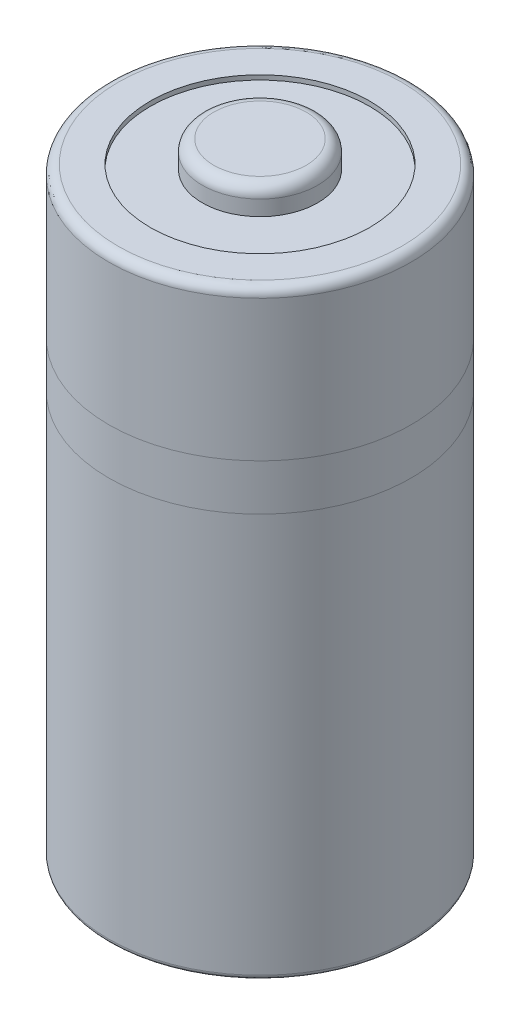
ISO-10303-21;
HEADER;
FILE_DESCRIPTION(('STEP AP214'),'2;1');
FILE_NAME('part.step','',(''),(''),'','','');
FILE_SCHEMA(('AUTOMOTIVE_DESIGN { 1 0 10303 214 1 1 1 1 }'));
ENDSEC;
DATA;
#1=APPLICATION_CONTEXT('core data for automotive mechanical design processes');
#2=APPLICATION_PROTOCOL_DEFINITION('international standard','automotive_design',2000,#1);
#3=PRODUCT_CONTEXT('',#1,'mechanical');
#4=PRODUCT('Part','Part','',(#3));
#5=PRODUCT_RELATED_PRODUCT_CATEGORY('part','',(#4));
#6=PRODUCT_DEFINITION_FORMATION('','',#4);
#7=PRODUCT_DEFINITION_CONTEXT('part definition',#1,'design');
#8=PRODUCT_DEFINITION('design','',#6,#7);
#9=PRODUCT_DEFINITION_SHAPE('','',#8);
#10=(LENGTH_UNIT() NAMED_UNIT(*) SI_UNIT(.MILLI.,.METRE.));
#11=(NAMED_UNIT(*) PLANE_ANGLE_UNIT() SI_UNIT($,.RADIAN.));
#12=(NAMED_UNIT(*) SI_UNIT($,.STERADIAN.) SOLID_ANGLE_UNIT());
#13=UNCERTAINTY_MEASURE_WITH_UNIT(LENGTH_MEASURE(1.E-05),#10,'distance_accuracy_value','');
#14=(GEOMETRIC_REPRESENTATION_CONTEXT(3) GLOBAL_UNCERTAINTY_ASSIGNED_CONTEXT((#13)) GLOBAL_UNIT_ASSIGNED_CONTEXT((#10,
#11,#12)) REPRESENTATION_CONTEXT('',''));
#15=CARTESIAN_POINT('',(0.,0.,0.));
#16=DIRECTION('',(0.,0.,1.));
#17=DIRECTION('',(1.,0.,0.));
#18=AXIS2_PLACEMENT_3D('',#15,#16,#17);
#19=CARTESIAN_POINT('',(0.,32.7406,0.));
#20=DIRECTION('',(0.,1.,0.));
#21=DIRECTION('',(0.,0.,1.));
#22=AXIS2_PLACEMENT_3D('',#19,#20,#21);
#23=PLANE('',#22);
#24=CARTESIAN_POINT('',(0.,32.7406,0.));
#25=DIRECTION('',(0.,1.,0.));
#26=DIRECTION('',(0.,0.,1.));
#27=AXIS2_PLACEMENT_3D('',#24,#25,#26);
#28=CIRCLE('',#27,6.0325);
#29=CARTESIAN_POINT('',(0.,32.7406,6.0325));
#30=VERTEX_POINT('',#29);
#31=EDGE_CURVE('P0_E130',#30,#30,#28,.T.);
#32=ORIENTED_EDGE('',*,*,#31,.T.);
#33=EDGE_LOOP('',(#32));
#34=FACE_BOUND('',#33,.T.);
#35=ADVANCED_FACE('P0_F16',(#34),#23,.T.);
#36=CARTESIAN_POINT('',(0.,32.7406,0.));
#37=DIRECTION('',(0.,1.,0.));
#38=DIRECTION('',(0.,0.,1.));
#39=AXIS2_PLACEMENT_3D('',#36,#37,#38);
#40=CYLINDRICAL_SURFACE('',#39,6.0325);
#41=CARTESIAN_POINT('',(0.,33.02,0.));
#42=DIRECTION('',(0.,1.,0.));
#43=DIRECTION('',(0.,0.,1.));
#44=AXIS2_PLACEMENT_3D('',#41,#42,#43);
#45=CIRCLE('',#44,6.0325);
#46=CARTESIAN_POINT('',(0.,33.02,6.0325));
#47=VERTEX_POINT('',#46);
#48=EDGE_CURVE('P0_E41',#47,#47,#45,.F.);
#49=ORIENTED_EDGE('',*,*,#48,.F.);
#50=EDGE_LOOP('',(#49));
#51=FACE_BOUND('',#50,.T.);
#52=ORIENTED_EDGE('',*,*,#31,.F.);
#53=EDGE_LOOP('',(#52));
#54=FACE_BOUND('',#53,.T.);
#55=ADVANCED_FACE('P0_F98',(#51,#54),#40,.F.);
#56=CARTESIAN_POINT('',(0.,33.02,0.));
#57=DIRECTION('',(0.,1.,0.));
#58=DIRECTION('',(0.,0.,1.));
#59=AXIS2_PLACEMENT_3D('',#56,#57,#58);
#60=PLANE('',#59);
#61=CARTESIAN_POINT('',(0.,33.02,0.));
#62=DIRECTION('',(0.,-1.,0.));
#63=DIRECTION('',(0.,0.,-1.));
#64=AXIS2_PLACEMENT_3D('',#61,#62,#63);
#65=CIRCLE('',#64,7.8105);
#66=CARTESIAN_POINT('',(0.,33.02,-7.8105));
#67=VERTEX_POINT('',#66);
#68=CARTESIAN_POINT('',(0.,33.02,7.8105));
#69=VERTEX_POINT('',#68);
#70=EDGE_CURVE('P0_E33',#67,#69,#65,.T.);
#71=ORIENTED_EDGE('',*,*,#70,.F.);
#72=CARTESIAN_POINT('',(0.,33.02,0.));
#73=DIRECTION('',(0.,-1.,0.));
#74=DIRECTION('',(0.,0.,1.));
#75=AXIS2_PLACEMENT_3D('',#72,#73,#74);
#76=CIRCLE('',#75,7.8105);
#77=EDGE_CURVE('P0_E39',#69,#67,#76,.T.);
#78=ORIENTED_EDGE('',*,*,#77,.F.);
#79=EDGE_LOOP('',(#71,#78));
#80=FACE_BOUND('',#79,.T.);
#81=ORIENTED_EDGE('',*,*,#48,.T.);
#82=EDGE_LOOP('',(#81));
#83=FACE_BOUND('',#82,.T.);
#84=ADVANCED_FACE('P0_F37',(#80,#83),#60,.T.);
#85=CARTESIAN_POINT('',(0.,32.512,0.));
#86=DIRECTION('',(0.,1.,0.));
#87=DIRECTION('',(0.,0.,1.));
#88=AXIS2_PLACEMENT_3D('',#85,#86,#87);
#89=TOROIDAL_SURFACE('',#88,7.8105,0.508);
#90=CARTESIAN_POINT('',(0.,32.512,0.));
#91=DIRECTION('',(0.,-1.,0.));
#92=DIRECTION('',(0.,0.,-1.));
#93=AXIS2_PLACEMENT_3D('',#90,#91,#92);
#94=CIRCLE('',#93,8.3185);
#95=CARTESIAN_POINT('',(0.,32.512,-8.3185));
#96=VERTEX_POINT('',#95);
#97=EDGE_CURVE('P0_E27',#96,#96,#94,.T.);
#98=ORIENTED_EDGE('',*,*,#97,.F.);
#99=EDGE_LOOP('',(#98));
#100=FACE_BOUND('',#99,.T.);
#101=ORIENTED_EDGE('',*,*,#77,.T.);
#102=ORIENTED_EDGE('',*,*,#70,.T.);
#103=EDGE_LOOP('',(#101,#102));
#104=FACE_BOUND('',#103,.T.);
#105=ADVANCED_FACE('P0_F45',(#100,#104),#89,.T.);
#106=CARTESIAN_POINT('',(0.,89.5682710372012,0.));
#107=DIRECTION('',(0.,-1.,0.));
#108=DIRECTION('',(0.,0.,-1.));
#109=AXIS2_PLACEMENT_3D('',#106,#107,#108);
#110=CYLINDRICAL_SURFACE('',#109,8.3185);
#111=ORIENTED_EDGE('',*,*,#97,.T.);
#112=EDGE_LOOP('',(#111));
#113=FACE_BOUND('',#112,.T.);
#114=CARTESIAN_POINT('',(0.,24.765,0.));
#115=DIRECTION('',(0.,-1.,0.));
#116=DIRECTION('',(0.,0.,-1.));
#117=AXIS2_PLACEMENT_3D('',#114,#115,#116);
#118=CIRCLE('',#117,8.3185);
#119=CARTESIAN_POINT('',(0.,24.765,-8.3185));
#120=VERTEX_POINT('',#119);
#121=EDGE_CURVE('P0_E11',#120,#120,#118,.F.);
#122=ORIENTED_EDGE('',*,*,#121,.T.);
#123=EDGE_LOOP('',(#122));
#124=FACE_BOUND('',#123,.T.);
#125=ADVANCED_FACE('P0_F62',(#113,#124),#110,.T.);
#126=CARTESIAN_POINT('',(0.,24.765,0.));
#127=DIRECTION('',(0.,1.,0.));
#128=DIRECTION('',(0.,0.,1.));
#129=AXIS2_PLACEMENT_3D('',#126,#127,#128);
#130=PLANE('',#129);
#131=ORIENTED_EDGE('',*,*,#121,.F.);
#132=EDGE_LOOP('',(#131));
#133=FACE_BOUND('',#132,.T.);
#134=ADVANCED_FACE('P0_F74',(#133),#130,.F.);
#135=CLOSED_SHELL('',(#35,#55,#84,#105,#125,#134));
#136=MANIFOLD_SOLID_BREP('P0_B1',#135);
#137=CARTESIAN_POINT('',(0.,34.2392,0.));
#138=DIRECTION('',(0.,1.,0.));
#139=DIRECTION('',(0.,0.,1.));
#140=AXIS2_PLACEMENT_3D('',#137,#138,#139);
#141=PLANE('',#140);
#142=CARTESIAN_POINT('',(0.,34.2392,0.));
#143=DIRECTION('',(0.,-1.,0.));
#144=DIRECTION('',(0.,0.,-1.));
#145=AXIS2_PLACEMENT_3D('',#142,#143,#144);
#146=CIRCLE('',#145,2.54);
#147=CARTESIAN_POINT('',(0.,34.2392,-2.54));
#148=VERTEX_POINT('',#147);
#149=CARTESIAN_POINT('',(0.,34.2392,2.54));
#150=VERTEX_POINT('',#149);
#151=EDGE_CURVE('P1_E33',#148,#150,#146,.T.);
#152=ORIENTED_EDGE('',*,*,#151,.F.);
#153=CARTESIAN_POINT('',(0.,34.2392,0.));
#154=DIRECTION('',(0.,-1.,0.));
#155=DIRECTION('',(0.,0.,1.));
#156=AXIS2_PLACEMENT_3D('',#153,#154,#155);
#157=CIRCLE('',#156,2.54);
#158=EDGE_CURVE('P1_E37',#150,#148,#157,.T.);
#159=ORIENTED_EDGE('',*,*,#158,.F.);
#160=EDGE_LOOP('',(#152,#159));
#161=FACE_BOUND('',#160,.T.);
#162=ADVANCED_FACE('P1_F16',(#161),#141,.T.);
#163=CARTESIAN_POINT('',(0.,33.6042,0.));
#164=DIRECTION('',(0.,1.,0.));
#165=DIRECTION('',(0.,0.,1.));
#166=AXIS2_PLACEMENT_3D('',#163,#164,#165);
#167=TOROIDAL_SURFACE('',#166,2.54,0.635);
#168=CARTESIAN_POINT('',(0.,33.6042,0.));
#169=DIRECTION('',(0.,-1.,0.));
#170=DIRECTION('',(0.,0.,-1.));
#171=AXIS2_PLACEMENT_3D('',#168,#169,#170);
#172=CIRCLE('',#171,3.175);
#173=CARTESIAN_POINT('',(0.,33.6042,-3.175));
#174=VERTEX_POINT('',#173);
#175=EDGE_CURVE('P1_E27',#174,#174,#172,.T.);
#176=ORIENTED_EDGE('',*,*,#175,.F.);
#177=EDGE_LOOP('',(#176));
#178=FACE_BOUND('',#177,.T.);
#179=ORIENTED_EDGE('',*,*,#158,.T.);
#180=ORIENTED_EDGE('',*,*,#151,.T.);
#181=EDGE_LOOP('',(#179,#180));
#182=FACE_BOUND('',#181,.T.);
#183=ADVANCED_FACE('P1_F42',(#178,#182),#167,.T.);
#184=CARTESIAN_POINT('',(0.,34.2392,0.));
#185=DIRECTION('',(0.,-1.,0.));
#186=DIRECTION('',(0.,0.,-1.));
#187=AXIS2_PLACEMENT_3D('',#184,#185,#186);
#188=CYLINDRICAL_SURFACE('',#187,3.175);
#189=ORIENTED_EDGE('',*,*,#175,.T.);
#190=EDGE_LOOP('',(#189));
#191=FACE_BOUND('',#190,.T.);
#192=CARTESIAN_POINT('',(0.,32.766,0.));
#193=DIRECTION('',(0.,-1.,0.));
#194=DIRECTION('',(0.,0.,-1.));
#195=AXIS2_PLACEMENT_3D('',#192,#193,#194);
#196=CIRCLE('',#195,3.175);
#197=CARTESIAN_POINT('',(0.,32.766,-3.175));
#198=VERTEX_POINT('',#197);
#199=EDGE_CURVE('P1_E11',#198,#198,#196,.F.);
#200=ORIENTED_EDGE('',*,*,#199,.T.);
#201=EDGE_LOOP('',(#200));
#202=FACE_BOUND('',#201,.T.);
#203=ADVANCED_FACE('P1_F57',(#191,#202),#188,.T.);
#204=CARTESIAN_POINT('',(0.,32.766,0.));
#205=DIRECTION('',(0.,1.,0.));
#206=DIRECTION('',(0.,0.,1.));
#207=AXIS2_PLACEMENT_3D('',#204,#205,#206);
#208=PLANE('',#207);
#209=ORIENTED_EDGE('',*,*,#199,.F.);
#210=EDGE_LOOP('',(#209));
#211=FACE_BOUND('',#210,.T.);
#212=ADVANCED_FACE('P1_F68',(#211),#208,.F.);
#213=CLOSED_SHELL('',(#162,#183,#203,#212));
#214=MANIFOLD_SOLID_BREP('P1_B1',#213);
#215=CARTESIAN_POINT('',(0.,32.7406,0.));
#216=DIRECTION('',(0.,1.,0.));
#217=DIRECTION('',(0.,0.,1.));
#218=AXIS2_PLACEMENT_3D('',#215,#216,#217);
#219=PLANE('',#218);
#220=CARTESIAN_POINT('',(0.,32.7406,0.));
#221=DIRECTION('',(0.,-1.,0.));
#222=DIRECTION('',(0.,0.,-1.));
#223=AXIS2_PLACEMENT_3D('',#220,#221,#222);
#224=CIRCLE('',#223,6.0325);
#225=CARTESIAN_POINT('',(0.,32.7406,-6.0325));
#226=VERTEX_POINT('',#225);
#227=EDGE_CURVE('P2_E17',#226,#226,#224,.F.);
#228=ORIENTED_EDGE('',*,*,#227,.F.);
#229=EDGE_LOOP('',(#228));
#230=FACE_BOUND('',#229,.T.);
#231=ADVANCED_FACE('P2_F14',(#230),#219,.F.);
#232=CARTESIAN_POINT('',(0.,32.766,0.));
#233=DIRECTION('',(0.,-1.,0.));
#234=DIRECTION('',(0.,0.,-1.));
#235=AXIS2_PLACEMENT_3D('',#232,#233,#234);
#236=CYLINDRICAL_SURFACE('',#235,6.0325);
#237=ORIENTED_EDGE('',*,*,#227,.T.);
#238=EDGE_LOOP('',(#237));
#239=FACE_BOUND('',#238,.T.);
#240=CARTESIAN_POINT('',(0.,32.766,0.));
#241=DIRECTION('',(0.,-1.,0.));
#242=DIRECTION('',(0.,0.,-1.));
#243=AXIS2_PLACEMENT_3D('',#240,#241,#242);
#244=CIRCLE('',#243,6.0325);
#245=CARTESIAN_POINT('',(0.,32.766,-6.0325));
#246=VERTEX_POINT('',#245);
#247=EDGE_CURVE('P2_E10',#246,#246,#244,.F.);
#248=ORIENTED_EDGE('',*,*,#247,.F.);
#249=EDGE_LOOP('',(#248));
#250=FACE_BOUND('',#249,.T.);
#251=ADVANCED_FACE('P2_F26',(#239,#250),#236,.T.);
#252=CARTESIAN_POINT('',(0.,32.766,0.));
#253=DIRECTION('',(0.,1.,0.));
#254=DIRECTION('',(0.,0.,1.));
#255=AXIS2_PLACEMENT_3D('',#252,#253,#254);
#256=PLANE('',#255);
#257=ORIENTED_EDGE('',*,*,#247,.T.);
#258=EDGE_LOOP('',(#257));
#259=FACE_BOUND('',#258,.T.);
#260=ADVANCED_FACE('P2_F34',(#259),#256,.T.);
#261=CLOSED_SHELL('',(#231,#251,#260));
#262=MANIFOLD_SOLID_BREP('P2_B1',#261);
#263=CARTESIAN_POINT('',(0.,0.6604,0.));
#264=DIRECTION('',(0.,-1.,0.));
#265=DIRECTION('',(0.,0.,-1.));
#266=AXIS2_PLACEMENT_3D('',#263,#264,#265);
#267=PLANE('',#266);
#268=CARTESIAN_POINT('',(0.,0.6604,0.));
#269=DIRECTION('',(0.,1.,0.));
#270=DIRECTION('',(0.,0.,1.));
#271=AXIS2_PLACEMENT_3D('',#268,#269,#270);
#272=CIRCLE('',#271,6.0325);
#273=CARTESIAN_POINT('',(0.,0.6604,6.0325));
#274=VERTEX_POINT('',#273);
#275=EDGE_CURVE('P3_E17',#274,#274,#272,.F.);
#276=ORIENTED_EDGE('',*,*,#275,.F.);
#277=EDGE_LOOP('',(#276));
#278=FACE_BOUND('',#277,.T.);
#279=ADVANCED_FACE('P3_F14',(#278),#267,.F.);
#280=CARTESIAN_POINT('',(0.,0.635,0.));
#281=DIRECTION('',(0.,1.,0.));
#282=DIRECTION('',(0.,0.,1.));
#283=AXIS2_PLACEMENT_3D('',#280,#281,#282);
#284=CYLINDRICAL_SURFACE('',#283,6.0325);
#285=ORIENTED_EDGE('',*,*,#275,.T.);
#286=EDGE_LOOP('',(#285));
#287=FACE_BOUND('',#286,.T.);
#288=CARTESIAN_POINT('',(0.,0.635,0.));
#289=DIRECTION('',(0.,1.,0.));
#290=DIRECTION('',(0.,0.,1.));
#291=AXIS2_PLACEMENT_3D('',#288,#289,#290);
#292=CIRCLE('',#291,6.0325);
#293=CARTESIAN_POINT('',(0.,0.635,6.0325));
#294=VERTEX_POINT('',#293);
#295=EDGE_CURVE('P3_E10',#294,#294,#292,.F.);
#296=ORIENTED_EDGE('',*,*,#295,.F.);
#297=EDGE_LOOP('',(#296));
#298=FACE_BOUND('',#297,.T.);
#299=ADVANCED_FACE('P3_F26',(#287,#298),#284,.T.);
#300=CARTESIAN_POINT('',(0.,0.635,0.));
#301=DIRECTION('',(0.,-1.,0.));
#302=DIRECTION('',(0.,0.,-1.));
#303=AXIS2_PLACEMENT_3D('',#300,#301,#302);
#304=PLANE('',#303);
#305=ORIENTED_EDGE('',*,*,#295,.T.);
#306=EDGE_LOOP('',(#305));
#307=FACE_BOUND('',#306,.T.);
#308=ADVANCED_FACE('P3_F34',(#307),#304,.T.);
#309=CLOSED_SHELL('',(#279,#299,#308));
#310=MANIFOLD_SOLID_BREP('P3_B1',#309);
#311=CARTESIAN_POINT('',(0.,0.6604,0.));
#312=DIRECTION('',(0.,-1.,0.));
#313=DIRECTION('',(0.,0.,-1.));
#314=AXIS2_PLACEMENT_3D('',#311,#312,#313);
#315=PLANE('',#314);
#316=CARTESIAN_POINT('',(0.,0.6604,0.));
#317=DIRECTION('',(0.,-1.,0.));
#318=DIRECTION('',(0.,0.,-1.));
#319=AXIS2_PLACEMENT_3D('',#316,#317,#318);
#320=CIRCLE('',#319,6.0325);
#321=CARTESIAN_POINT('',(0.,0.6604,-6.0325));
#322=VERTEX_POINT('',#321);
#323=EDGE_CURVE('P4_E47',#322,#322,#320,.T.);
#324=ORIENTED_EDGE('',*,*,#323,.T.);
#325=EDGE_LOOP('',(#324));
#326=FACE_BOUND('',#325,.T.);
#327=ADVANCED_FACE('P4_F16',(#326),#315,.T.);
#328=CARTESIAN_POINT('',(0.,0.6604,0.));
#329=DIRECTION('',(0.,-1.,0.));
#330=DIRECTION('',(0.,0.,-1.));
#331=AXIS2_PLACEMENT_3D('',#328,#329,#330);
#332=CYLINDRICAL_SURFACE('',#331,6.0325);
#333=ORIENTED_EDGE('',*,*,#323,.F.);
#334=EDGE_LOOP('',(#333));
#335=FACE_BOUND('',#334,.T.);
#336=CARTESIAN_POINT('',(0.,0.,0.));
#337=DIRECTION('',(0.,-1.,0.));
#338=DIRECTION('',(0.,0.,-1.));
#339=AXIS2_PLACEMENT_3D('',#336,#337,#338);
#340=CIRCLE('',#339,6.0325);
#341=CARTESIAN_POINT('',(0.,0.,-6.0325));
#342=VERTEX_POINT('',#341);
#343=EDGE_CURVE('P4_E45',#342,#342,#340,.T.);
#344=ORIENTED_EDGE('',*,*,#343,.T.);
#345=EDGE_LOOP('',(#344));
#346=FACE_BOUND('',#345,.T.);
#347=ADVANCED_FACE('P4_F76',(#335,#346),#332,.F.);
#348=CARTESIAN_POINT('',(0.,0.,0.));
#349=DIRECTION('',(0.,1.,0.));
#350=DIRECTION('',(0.,0.,1.));
#351=AXIS2_PLACEMENT_3D('',#348,#349,#350);
#352=PLANE('',#351);
#353=CARTESIAN_POINT('',(0.,0.,0.));
#354=DIRECTION('',(0.,1.,0.));
#355=DIRECTION('',(0.,0.,1.));
#356=AXIS2_PLACEMENT_3D('',#353,#354,#355);
#357=CIRCLE('',#356,8.0645);
#358=CARTESIAN_POINT('',(0.,0.,8.0645));
#359=VERTEX_POINT('',#358);
#360=CARTESIAN_POINT('',(0.,0.,-8.0645));
#361=VERTEX_POINT('',#360);
#362=EDGE_CURVE('P4_E36',#359,#361,#357,.T.);
#363=ORIENTED_EDGE('',*,*,#362,.F.);
#364=CARTESIAN_POINT('',(0.,0.,0.));
#365=DIRECTION('',(0.,1.,0.));
#366=DIRECTION('',(0.,0.,-1.));
#367=AXIS2_PLACEMENT_3D('',#364,#365,#366);
#368=CIRCLE('',#367,8.0645);
#369=EDGE_CURVE('P4_E33',#361,#359,#368,.T.);
#370=ORIENTED_EDGE('',*,*,#369,.F.);
#371=EDGE_LOOP('',(#363,#370));
#372=FACE_BOUND('',#371,.T.);
#373=ORIENTED_EDGE('',*,*,#343,.F.);
#374=EDGE_LOOP('',(#373));
#375=FACE_BOUND('',#374,.T.);
#376=ADVANCED_FACE('P4_F38',(#372,#375),#352,.F.);
#377=CARTESIAN_POINT('',(0.,22.225,0.));
#378=DIRECTION('',(0.,1.,0.));
#379=DIRECTION('',(0.,0.,1.));
#380=AXIS2_PLACEMENT_3D('',#377,#378,#379);
#381=PLANE('',#380);
#382=CARTESIAN_POINT('',(0.,22.225,0.));
#383=DIRECTION('',(0.,-1.,0.));
#384=DIRECTION('',(0.,0.,-1.));
#385=AXIS2_PLACEMENT_3D('',#382,#383,#384);
#386=CIRCLE('',#385,8.3185);
#387=CARTESIAN_POINT('',(0.,22.225,-8.3185));
#388=VERTEX_POINT('',#387);
#389=EDGE_CURVE('P4_E26',#388,#388,#386,.T.);
#390=ORIENTED_EDGE('',*,*,#389,.F.);
#391=EDGE_LOOP('',(#390));
#392=FACE_BOUND('',#391,.T.);
#393=ADVANCED_FACE('P4_F67',(#392),#381,.T.);
#394=CARTESIAN_POINT('',(0.,0.254000000000001,0.));
#395=DIRECTION('',(0.,1.,0.));
#396=DIRECTION('',(0.,0.,1.));
#397=AXIS2_PLACEMENT_3D('',#394,#395,#396);
#398=TOROIDAL_SURFACE('',#397,8.0645,0.254);
#399=CARTESIAN_POINT('',(0.,0.254000000000001,0.));
#400=DIRECTION('',(0.,-1.,0.));
#401=DIRECTION('',(0.,0.,-1.));
#402=AXIS2_PLACEMENT_3D('',#399,#400,#401);
#403=CIRCLE('',#402,8.3185);
#404=CARTESIAN_POINT('',(0.,0.254000000000001,-8.3185));
#405=VERTEX_POINT('',#404);
#406=EDGE_CURVE('P4_E11',#405,#405,#403,.F.);
#407=ORIENTED_EDGE('',*,*,#406,.F.);
#408=EDGE_LOOP('',(#407));
#409=FACE_BOUND('',#408,.T.);
#410=ORIENTED_EDGE('',*,*,#362,.T.);
#411=ORIENTED_EDGE('',*,*,#369,.T.);
#412=EDGE_LOOP('',(#410,#411));
#413=FACE_BOUND('',#412,.T.);
#414=ADVANCED_FACE('P4_F44',(#409,#413),#398,.T.);
#415=CARTESIAN_POINT('',(0.,22.225,0.));
#416=DIRECTION('',(0.,-1.,0.));
#417=DIRECTION('',(0.,0.,-1.));
#418=AXIS2_PLACEMENT_3D('',#415,#416,#417);
#419=CYLINDRICAL_SURFACE('',#418,8.3185);
#420=ORIENTED_EDGE('',*,*,#406,.T.);
#421=EDGE_LOOP('',(#420));
#422=FACE_BOUND('',#421,.T.);
#423=ORIENTED_EDGE('',*,*,#389,.T.);
#424=EDGE_LOOP('',(#423));
#425=FACE_BOUND('',#424,.T.);
#426=ADVANCED_FACE('P4_F66',(#422,#425),#419,.T.);
#427=CLOSED_SHELL('',(#327,#347,#376,#393,#414,#426));
#428=MANIFOLD_SOLID_BREP('P4_B1',#427);
#429=CARTESIAN_POINT('',(0.,22.225,0.));
#430=DIRECTION('',(0.,1.,0.));
#431=DIRECTION('',(0.,0.,1.));
#432=AXIS2_PLACEMENT_3D('',#429,#430,#431);
#433=PLANE('',#432);
#434=CARTESIAN_POINT('',(0.,22.225,0.));
#435=DIRECTION('',(0.,-1.,0.));
#436=DIRECTION('',(0.,0.,-1.));
#437=AXIS2_PLACEMENT_3D('',#434,#435,#436);
#438=CIRCLE('',#437,8.3185);
#439=CARTESIAN_POINT('',(0.,22.225,-8.3185));
#440=VERTEX_POINT('',#439);
#441=EDGE_CURVE('P5_E17',#440,#440,#438,.F.);
#442=ORIENTED_EDGE('',*,*,#441,.F.);
#443=EDGE_LOOP('',(#442));
#444=FACE_BOUND('',#443,.T.);
#445=ADVANCED_FACE('P5_F14',(#444),#433,.F.);
#446=CARTESIAN_POINT('',(0.,24.765,0.));
#447=DIRECTION('',(0.,-1.,0.));
#448=DIRECTION('',(0.,0.,-1.));
#449=AXIS2_PLACEMENT_3D('',#446,#447,#448);
#450=CYLINDRICAL_SURFACE('',#449,8.3185);
#451=ORIENTED_EDGE('',*,*,#441,.T.);
#452=EDGE_LOOP('',(#451));
#453=FACE_BOUND('',#452,.T.);
#454=CARTESIAN_POINT('',(0.,24.765,0.));
#455=DIRECTION('',(0.,-1.,0.));
#456=DIRECTION('',(0.,0.,-1.));
#457=AXIS2_PLACEMENT_3D('',#454,#455,#456);
#458=CIRCLE('',#457,8.3185);
#459=CARTESIAN_POINT('',(0.,24.765,-8.3185));
#460=VERTEX_POINT('',#459);
#461=EDGE_CURVE('P5_E10',#460,#460,#458,.F.);
#462=ORIENTED_EDGE('',*,*,#461,.F.);
#463=EDGE_LOOP('',(#462));
#464=FACE_BOUND('',#463,.T.);
#465=ADVANCED_FACE('P5_F26',(#453,#464),#450,.T.);
#466=CARTESIAN_POINT('',(0.,24.765,0.));
#467=DIRECTION('',(0.,1.,0.));
#468=DIRECTION('',(0.,0.,1.));
#469=AXIS2_PLACEMENT_3D('',#466,#467,#468);
#470=PLANE('',#469);
#471=ORIENTED_EDGE('',*,*,#461,.T.);
#472=EDGE_LOOP('',(#471));
#473=FACE_BOUND('',#472,.T.);
#474=ADVANCED_FACE('P5_F34',(#473),#470,.T.);
#475=CLOSED_SHELL('',(#445,#465,#474));
#476=MANIFOLD_SOLID_BREP('P5_B1',#475);
#477=ADVANCED_BREP_SHAPE_REPRESENTATION('',(#18,#136,#214,#262,#310,#428,#476),#14);
#478=SHAPE_DEFINITION_REPRESENTATION(#9,#477);
ENDSEC;
END-ISO-10303-21;
